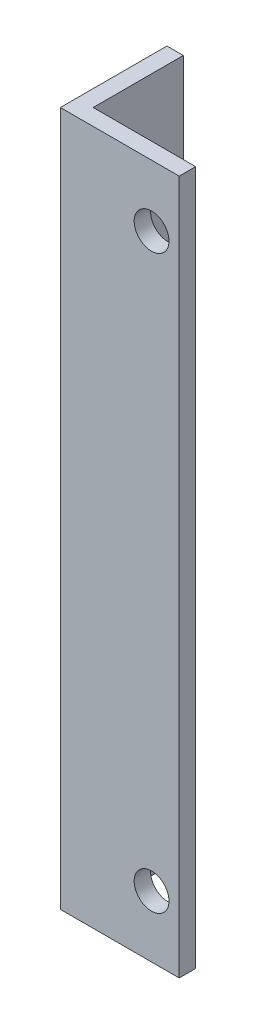
ISO-10303-21;
HEADER;
FILE_DESCRIPTION(('STEP AP214'),'2;1');
FILE_NAME('part.step','',(''),(''),'','','');
FILE_SCHEMA(('AUTOMOTIVE_DESIGN { 1 0 10303 214 1 1 1 1 }'));
ENDSEC;
DATA;
#1=APPLICATION_CONTEXT('core data for automotive mechanical design processes');
#2=APPLICATION_PROTOCOL_DEFINITION('international standard','automotive_design',2000,#1);
#3=PRODUCT_CONTEXT('',#1,'mechanical');
#4=PRODUCT('Part','Part','',(#3));
#5=PRODUCT_RELATED_PRODUCT_CATEGORY('part','',(#4));
#6=PRODUCT_DEFINITION_FORMATION('','',#4);
#7=PRODUCT_DEFINITION_CONTEXT('part definition',#1,'design');
#8=PRODUCT_DEFINITION('design','',#6,#7);
#9=PRODUCT_DEFINITION_SHAPE('','',#8);
#10=(LENGTH_UNIT() NAMED_UNIT(*) SI_UNIT(.MILLI.,.METRE.));
#11=(NAMED_UNIT(*) PLANE_ANGLE_UNIT() SI_UNIT($,.RADIAN.));
#12=(NAMED_UNIT(*) SI_UNIT($,.STERADIAN.) SOLID_ANGLE_UNIT());
#13=UNCERTAINTY_MEASURE_WITH_UNIT(LENGTH_MEASURE(1.E-05),#10,'distance_accuracy_value','');
#14=(GEOMETRIC_REPRESENTATION_CONTEXT(3) GLOBAL_UNCERTAINTY_ASSIGNED_CONTEXT((#13)) GLOBAL_UNIT_ASSIGNED_CONTEXT((#10,
#11,#12)) REPRESENTATION_CONTEXT('',''));
#15=CARTESIAN_POINT('',(0.,0.,0.));
#16=DIRECTION('',(0.,0.,1.));
#17=DIRECTION('',(1.,0.,0.));
#18=AXIS2_PLACEMENT_3D('',#15,#16,#17);
#19=CARTESIAN_POINT('',(25.,195.,0.));
#20=DIRECTION('',(-1.,0.,0.));
#21=DIRECTION('',(0.,0.,1.));
#22=AXIS2_PLACEMENT_3D('',#19,#20,#21);
#23=PLANE('',#22);
#24=DIRECTION('',(0.,-1.,0.));
#25=VECTOR('',#24,1.);
#26=CARTESIAN_POINT('',(25.,195.,0.));
#27=LINE('',#26,#25);
#28=CARTESIAN_POINT('',(25.,169.5,0.));
#29=VERTEX_POINT('',#28);
#30=CARTESIAN_POINT('',(25.,0.,0.));
#31=VERTEX_POINT('',#30);
#32=EDGE_CURVE('E47',#29,#31,#27,.T.);
#33=ORIENTED_EDGE('',*,*,#32,.F.);
#34=DIRECTION('',(0.,0.,1.));
#35=VECTOR('',#34,1.);
#36=CARTESIAN_POINT('',(25.,169.5,-26.));
#37=LINE('',#36,#35);
#38=CARTESIAN_POINT('',(25.,169.5,4.));
#39=VERTEX_POINT('',#38);
#40=EDGE_CURVE('E91',#29,#39,#37,.T.);
#41=ORIENTED_EDGE('',*,*,#40,.T.);
#42=DIRECTION('',(0.,1.,0.));
#43=VECTOR('',#42,1.);
#44=CARTESIAN_POINT('',(25.,195.,4.));
#45=LINE('',#44,#43);
#46=CARTESIAN_POINT('',(25.,0.,4.));
#47=VERTEX_POINT('',#46);
#48=EDGE_CURVE('E97',#47,#39,#45,.T.);
#49=ORIENTED_EDGE('',*,*,#48,.F.);
#50=DIRECTION('',(0.,0.,-1.));
#51=VECTOR('',#50,1.);
#52=CARTESIAN_POINT('',(25.,0.,0.));
#53=LINE('',#52,#51);
#54=EDGE_CURVE('E141',#47,#31,#53,.T.);
#55=ORIENTED_EDGE('',*,*,#54,.T.);
#56=EDGE_LOOP('',(#33,#41,#49,#55));
#57=FACE_BOUND('',#56,.T.);
#58=ADVANCED_FACE('F39',(#57),#23,.F.);
#59=CARTESIAN_POINT('',(0.,195.,0.));
#60=DIRECTION('',(0.,0.,1.));
#61=DIRECTION('',(1.,0.,0.));
#62=AXIS2_PLACEMENT_3D('',#59,#60,#61);
#63=PLANE('',#62);
#64=CARTESIAN_POINT('',(18.25,154.5,0.));
#65=DIRECTION('',(0.,0.,1.));
#66=DIRECTION('',(1.,0.,0.));
#67=AXIS2_PLACEMENT_3D('',#64,#65,#66);
#68=CIRCLE('',#67,4.25);
#69=CARTESIAN_POINT('',(22.5,154.5,0.));
#70=VERTEX_POINT('',#69);
#71=EDGE_CURVE('E100',#70,#70,#68,.T.);
#72=ORIENTED_EDGE('',*,*,#71,.T.);
#73=EDGE_LOOP('',(#72));
#74=FACE_BOUND('',#73,.T.);
#75=CARTESIAN_POINT('',(18.25,15.,0.));
#76=DIRECTION('',(0.,0.,1.));
#77=DIRECTION('',(1.,0.,0.));
#78=AXIS2_PLACEMENT_3D('',#75,#76,#77);
#79=CIRCLE('',#78,4.25000000000001);
#80=CARTESIAN_POINT('',(22.5,15.,0.));
#81=VERTEX_POINT('',#80);
#82=EDGE_CURVE('E137',#81,#81,#79,.T.);
#83=ORIENTED_EDGE('',*,*,#82,.T.);
#84=EDGE_LOOP('',(#83));
#85=FACE_BOUND('',#84,.T.);
#86=DIRECTION('',(0.,-1.,0.));
#87=VECTOR('',#86,1.);
#88=CARTESIAN_POINT('',(0.,195.,0.));
#89=LINE('',#88,#87);
#90=CARTESIAN_POINT('',(0.,169.5,0.));
#91=VERTEX_POINT('',#90);
#92=CARTESIAN_POINT('',(0.,0.,0.));
#93=VERTEX_POINT('',#92);
#94=EDGE_CURVE('E147',#91,#93,#89,.T.);
#95=ORIENTED_EDGE('',*,*,#94,.F.);
#96=DIRECTION('',(1.,0.,0.));
#97=VECTOR('',#96,1.);
#98=CARTESIAN_POINT('',(0.,169.5,0.));
#99=LINE('',#98,#97);
#100=EDGE_CURVE('E115',#91,#29,#99,.T.);
#101=ORIENTED_EDGE('',*,*,#100,.T.);
#102=ORIENTED_EDGE('',*,*,#32,.T.);
#103=DIRECTION('',(-1.,0.,0.));
#104=VECTOR('',#103,1.);
#105=CARTESIAN_POINT('',(0.,0.,0.));
#106=LINE('',#105,#104);
#107=EDGE_CURVE('E144',#31,#93,#106,.T.);
#108=ORIENTED_EDGE('',*,*,#107,.T.);
#109=EDGE_LOOP('',(#95,#101,#102,#108));
#110=FACE_BOUND('',#109,.T.);
#111=ADVANCED_FACE('F155',(#74,#85,#110),#63,.F.);
#112=CARTESIAN_POINT('',(0.,0.,0.));
#113=DIRECTION('',(0.,-1.,0.));
#114=DIRECTION('',(0.,0.,-1.));
#115=AXIS2_PLACEMENT_3D('',#112,#113,#114);
#116=PLANE('',#115);
#117=ORIENTED_EDGE('',*,*,#54,.F.);
#118=DIRECTION('',(1.,0.,0.));
#119=VECTOR('',#118,1.);
#120=CARTESIAN_POINT('',(25.,0.,4.));
#121=LINE('',#120,#119);
#122=CARTESIAN_POINT('',(-4.,0.,4.));
#123=VERTEX_POINT('',#122);
#124=EDGE_CURVE('E106',#123,#47,#121,.T.);
#125=ORIENTED_EDGE('',*,*,#124,.F.);
#126=DIRECTION('',(0.,0.,1.));
#127=VECTOR('',#126,1.);
#128=CARTESIAN_POINT('',(-4.,0.,3.));
#129=LINE('',#128,#127);
#130=CARTESIAN_POINT('',(-4.,0.,-22.));
#131=VERTEX_POINT('',#130);
#132=EDGE_CURVE('E128',#131,#123,#129,.T.);
#133=ORIENTED_EDGE('',*,*,#132,.F.);
#134=DIRECTION('',(-1.,0.,0.));
#135=VECTOR('',#134,1.);
#136=CARTESIAN_POINT('',(0.,0.,-22.));
#137=LINE('',#136,#135);
#138=CARTESIAN_POINT('',(0.,0.,-22.));
#139=VERTEX_POINT('',#138);
#140=EDGE_CURVE('E124',#139,#131,#137,.T.);
#141=ORIENTED_EDGE('',*,*,#140,.F.);
#142=DIRECTION('',(0.,0.,-1.));
#143=VECTOR('',#142,1.);
#144=CARTESIAN_POINT('',(0.,0.,3.));
#145=LINE('',#144,#143);
#146=EDGE_CURVE('E121',#93,#139,#145,.T.);
#147=ORIENTED_EDGE('',*,*,#146,.F.);
#148=ORIENTED_EDGE('',*,*,#107,.F.);
#149=EDGE_LOOP('',(#117,#125,#133,#141,#147,#148));
#150=FACE_BOUND('',#149,.T.);
#151=ADVANCED_FACE('F161',(#150),#116,.T.);
#152=CARTESIAN_POINT('',(18.25,15.,-192.));
#153=DIRECTION('',(0.,0.,1.));
#154=DIRECTION('',(1.,0.,0.));
#155=AXIS2_PLACEMENT_3D('',#152,#153,#154);
#156=CYLINDRICAL_SURFACE('',#155,4.25000000000001);
#157=ORIENTED_EDGE('',*,*,#82,.F.);
#158=EDGE_LOOP('',(#157));
#159=FACE_BOUND('',#158,.T.);
#160=CARTESIAN_POINT('',(18.25,15.,4.));
#161=DIRECTION('',(0.,0.,1.));
#162=DIRECTION('',(1.,0.,0.));
#163=AXIS2_PLACEMENT_3D('',#160,#161,#162);
#164=CIRCLE('',#163,4.25);
#165=CARTESIAN_POINT('',(22.5,15.,4.));
#166=VERTEX_POINT('',#165);
#167=EDGE_CURVE('E109',#166,#166,#164,.T.);
#168=ORIENTED_EDGE('',*,*,#167,.T.);
#169=EDGE_LOOP('',(#168));
#170=FACE_BOUND('',#169,.T.);
#171=ADVANCED_FACE('F157',(#159,#170),#156,.F.);
#172=CARTESIAN_POINT('',(0.,0.,3.));
#173=DIRECTION('',(1.,0.,0.));
#174=DIRECTION('',(0.,0.,-1.));
#175=AXIS2_PLACEMENT_3D('',#172,#173,#174);
#176=PLANE('',#175);
#177=DIRECTION('',(0.,0.,-1.));
#178=VECTOR('',#177,1.);
#179=CARTESIAN_POINT('',(0.,169.5,3.));
#180=LINE('',#179,#178);
#181=CARTESIAN_POINT('',(0.,169.5,-22.));
#182=VERTEX_POINT('',#181);
#183=EDGE_CURVE('E201',#91,#182,#180,.T.);
#184=ORIENTED_EDGE('',*,*,#183,.F.);
#185=ORIENTED_EDGE('',*,*,#94,.T.);
#186=ORIENTED_EDGE('',*,*,#146,.T.);
#187=DIRECTION('',(0.,1.,0.));
#188=VECTOR('',#187,1.);
#189=CARTESIAN_POINT('',(0.,0.,-22.));
#190=LINE('',#189,#188);
#191=EDGE_CURVE('E132',#139,#182,#190,.T.);
#192=ORIENTED_EDGE('',*,*,#191,.T.);
#193=EDGE_LOOP('',(#184,#185,#186,#192));
#194=FACE_BOUND('',#193,.T.);
#195=ADVANCED_FACE('F160',(#194),#176,.T.);
#196=CARTESIAN_POINT('',(-4.,0.,3.));
#197=DIRECTION('',(-1.,0.,0.));
#198=DIRECTION('',(0.,0.,1.));
#199=AXIS2_PLACEMENT_3D('',#196,#197,#198);
#200=PLANE('',#199);
#201=DIRECTION('',(0.,0.,1.));
#202=VECTOR('',#201,1.);
#203=CARTESIAN_POINT('',(-4.,169.5,3.));
#204=LINE('',#203,#202);
#205=CARTESIAN_POINT('',(-4.,169.5,-22.));
#206=VERTEX_POINT('',#205);
#207=CARTESIAN_POINT('',(-4.,169.5,4.));
#208=VERTEX_POINT('',#207);
#209=EDGE_CURVE('E54',#206,#208,#204,.T.);
#210=ORIENTED_EDGE('',*,*,#209,.F.);
#211=DIRECTION('',(0.,1.,0.));
#212=VECTOR('',#211,1.);
#213=CARTESIAN_POINT('',(-4.,0.,-22.));
#214=LINE('',#213,#212);
#215=EDGE_CURVE('E133',#131,#206,#214,.T.);
#216=ORIENTED_EDGE('',*,*,#215,.F.);
#217=ORIENTED_EDGE('',*,*,#132,.T.);
#218=DIRECTION('',(0.,-1.,0.));
#219=VECTOR('',#218,1.);
#220=CARTESIAN_POINT('',(-4.,195.,4.));
#221=LINE('',#220,#219);
#222=EDGE_CURVE('E108',#208,#123,#221,.T.);
#223=ORIENTED_EDGE('',*,*,#222,.F.);
#224=EDGE_LOOP('',(#210,#216,#217,#223));
#225=FACE_BOUND('',#224,.T.);
#226=ADVANCED_FACE('F175',(#225),#200,.T.);
#227=CARTESIAN_POINT('',(0.,0.,-22.));
#228=DIRECTION('',(0.,0.,-1.));
#229=DIRECTION('',(-1.,0.,0.));
#230=AXIS2_PLACEMENT_3D('',#227,#228,#229);
#231=PLANE('',#230);
#232=DIRECTION('',(-1.,0.,0.));
#233=VECTOR('',#232,1.);
#234=CARTESIAN_POINT('',(0.,169.5,-22.));
#235=LINE('',#234,#233);
#236=EDGE_CURVE('E99',#182,#206,#235,.T.);
#237=ORIENTED_EDGE('',*,*,#236,.F.);
#238=ORIENTED_EDGE('',*,*,#191,.F.);
#239=ORIENTED_EDGE('',*,*,#140,.T.);
#240=ORIENTED_EDGE('',*,*,#215,.T.);
#241=EDGE_LOOP('',(#237,#238,#239,#240));
#242=FACE_BOUND('',#241,.T.);
#243=ADVANCED_FACE('F165',(#242),#231,.T.);
#244=CARTESIAN_POINT('',(0.,0.,4.));
#245=DIRECTION('',(0.,0.,-1.));
#246=DIRECTION('',(-1.,0.,0.));
#247=AXIS2_PLACEMENT_3D('',#244,#245,#246);
#248=PLANE('',#247);
#249=CARTESIAN_POINT('',(18.25,154.5,4.));
#250=DIRECTION('',(0.,0.,1.));
#251=DIRECTION('',(1.,0.,0.));
#252=AXIS2_PLACEMENT_3D('',#249,#250,#251);
#253=CIRCLE('',#252,4.25);
#254=CARTESIAN_POINT('',(22.5,154.5,4.));
#255=VERTEX_POINT('',#254);
#256=EDGE_CURVE('E218',#255,#255,#253,.T.);
#257=ORIENTED_EDGE('',*,*,#256,.F.);
#258=EDGE_LOOP('',(#257));
#259=FACE_BOUND('',#258,.T.);
#260=ORIENTED_EDGE('',*,*,#48,.T.);
#261=DIRECTION('',(-1.,0.,0.));
#262=VECTOR('',#261,1.);
#263=CARTESIAN_POINT('',(0.,169.5,4.));
#264=LINE('',#263,#262);
#265=EDGE_CURVE('E11',#39,#208,#264,.T.);
#266=ORIENTED_EDGE('',*,*,#265,.T.);
#267=ORIENTED_EDGE('',*,*,#222,.T.);
#268=ORIENTED_EDGE('',*,*,#124,.T.);
#269=EDGE_LOOP('',(#260,#266,#267,#268));
#270=FACE_BOUND('',#269,.T.);
#271=ORIENTED_EDGE('',*,*,#167,.F.);
#272=EDGE_LOOP('',(#271));
#273=FACE_BOUND('',#272,.T.);
#274=ADVANCED_FACE('F103',(#259,#270,#273),#248,.F.);
#275=CARTESIAN_POINT('',(25.,169.5,-26.));
#276=DIRECTION('',(0.,-1.,0.));
#277=DIRECTION('',(0.,0.,-1.));
#278=AXIS2_PLACEMENT_3D('',#275,#276,#277);
#279=PLANE('',#278);
#280=ORIENTED_EDGE('',*,*,#183,.T.);
#281=ORIENTED_EDGE('',*,*,#236,.T.);
#282=ORIENTED_EDGE('',*,*,#209,.T.);
#283=ORIENTED_EDGE('',*,*,#265,.F.);
#284=ORIENTED_EDGE('',*,*,#40,.F.);
#285=ORIENTED_EDGE('',*,*,#100,.F.);
#286=EDGE_LOOP('',(#280,#281,#282,#283,#284,#285));
#287=FACE_BOUND('',#286,.T.);
#288=ADVANCED_FACE('F90',(#287),#279,.F.);
#289=CARTESIAN_POINT('',(18.25,154.5,-26.));
#290=DIRECTION('',(0.,0.,1.));
#291=DIRECTION('',(1.,0.,0.));
#292=AXIS2_PLACEMENT_3D('',#289,#290,#291);
#293=CYLINDRICAL_SURFACE('',#292,4.25);
#294=ORIENTED_EDGE('',*,*,#256,.T.);
#295=EDGE_LOOP('',(#294));
#296=FACE_BOUND('',#295,.T.);
#297=ORIENTED_EDGE('',*,*,#71,.F.);
#298=EDGE_LOOP('',(#297));
#299=FACE_BOUND('',#298,.T.);
#300=ADVANCED_FACE('F172',(#296,#299),#293,.F.);
#301=CLOSED_SHELL('',(#58,#111,#151,#171,#195,#226,#243,#274,#288,#300));
#302=MANIFOLD_SOLID_BREP('B2',#301);
#303=ADVANCED_BREP_SHAPE_REPRESENTATION('',(#18,#302),#14);
#304=SHAPE_DEFINITION_REPRESENTATION(#9,#303);
ENDSEC;
END-ISO-10303-21;
